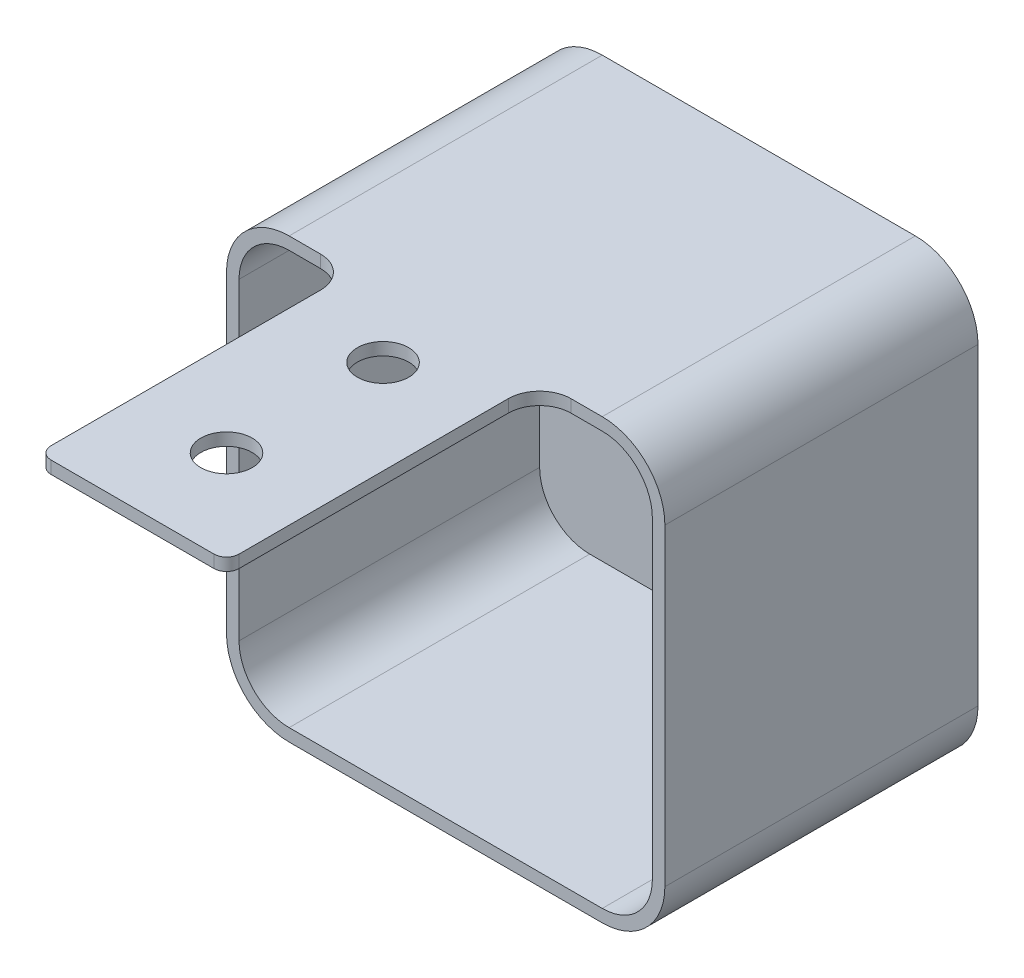
ISO-10303-21;
HEADER;
FILE_DESCRIPTION(('STEP AP214'),'2;1');
FILE_NAME('part.step','',(''),(''),'','','');
FILE_SCHEMA(('AUTOMOTIVE_DESIGN { 1 0 10303 214 1 1 1 1 }'));
ENDSEC;
DATA;
#1=APPLICATION_CONTEXT('core data for automotive mechanical design processes');
#2=APPLICATION_PROTOCOL_DEFINITION('international standard','automotive_design',2000,#1);
#3=PRODUCT_CONTEXT('',#1,'mechanical');
#4=PRODUCT('Part','Part','',(#3));
#5=PRODUCT_RELATED_PRODUCT_CATEGORY('part','',(#4));
#6=PRODUCT_DEFINITION_FORMATION('','',#4);
#7=PRODUCT_DEFINITION_CONTEXT('part definition',#1,'design');
#8=PRODUCT_DEFINITION('design','',#6,#7);
#9=PRODUCT_DEFINITION_SHAPE('','',#8);
#10=(LENGTH_UNIT() NAMED_UNIT(*) SI_UNIT(.MILLI.,.METRE.));
#11=(NAMED_UNIT(*) PLANE_ANGLE_UNIT() SI_UNIT($,.RADIAN.));
#12=(NAMED_UNIT(*) SI_UNIT($,.STERADIAN.) SOLID_ANGLE_UNIT());
#13=UNCERTAINTY_MEASURE_WITH_UNIT(LENGTH_MEASURE(1.E-05),#10,'distance_accuracy_value','');
#14=(GEOMETRIC_REPRESENTATION_CONTEXT(3) GLOBAL_UNCERTAINTY_ASSIGNED_CONTEXT((#13)) GLOBAL_UNIT_ASSIGNED_CONTEXT((#10,
#11,#12)) REPRESENTATION_CONTEXT('',''));
#15=CARTESIAN_POINT('',(0.,0.,0.));
#16=DIRECTION('',(0.,0.,1.));
#17=DIRECTION('',(1.,0.,0.));
#18=AXIS2_PLACEMENT_3D('',#15,#16,#17);
#19=CARTESIAN_POINT('',(0.,0.,50.));
#20=DIRECTION('',(0.,0.,-1.));
#21=DIRECTION('',(-1.,0.,0.));
#22=AXIS2_PLACEMENT_3D('',#19,#20,#21);
#23=PLANE('',#22);
#24=DIRECTION('',(-1.,0.,0.));
#25=VECTOR('',#24,1.);
#26=CARTESIAN_POINT('',(-35.,35.,50.));
#27=LINE('',#26,#25);
#28=CARTESIAN_POINT('',(25.,35.,50.));
#29=VERTEX_POINT('',#28);
#30=CARTESIAN_POINT('',(20.,35.,50.));
#31=VERTEX_POINT('',#30);
#32=EDGE_CURVE('E262',#29,#31,#27,.T.);
#33=ORIENTED_EDGE('',*,*,#32,.T.);
#34=DIRECTION('',(0.,1.,0.));
#35=VECTOR('',#34,1.);
#36=CARTESIAN_POINT('',(20.,0.,50.));
#37=LINE('',#36,#35);
#38=CARTESIAN_POINT('',(20.,33.,50.));
#39=VERTEX_POINT('',#38);
#40=EDGE_CURVE('E281',#31,#39,#37,.F.);
#41=ORIENTED_EDGE('',*,*,#40,.T.);
#42=DIRECTION('',(-1.,0.,0.));
#43=VECTOR('',#42,1.);
#44=CARTESIAN_POINT('',(0.,33.,50.));
#45=LINE('',#44,#43);
#46=CARTESIAN_POINT('',(25.,33.,50.));
#47=VERTEX_POINT('',#46);
#48=EDGE_CURVE('E257',#47,#39,#45,.T.);
#49=ORIENTED_EDGE('',*,*,#48,.F.);
#50=CARTESIAN_POINT('',(25.,25.,50.));
#51=DIRECTION('',(0.,0.,-1.));
#52=DIRECTION('',(-1.,0.,0.));
#53=AXIS2_PLACEMENT_3D('',#50,#51,#52);
#54=CIRCLE('',#53,8.);
#55=CARTESIAN_POINT('',(33.,25.,50.));
#56=VERTEX_POINT('',#55);
#57=EDGE_CURVE('E246',#56,#47,#54,.F.);
#58=ORIENTED_EDGE('',*,*,#57,.F.);
#59=DIRECTION('',(0.,1.,0.));
#60=VECTOR('',#59,1.);
#61=CARTESIAN_POINT('',(33.,0.,50.));
#62=LINE('',#61,#60);
#63=CARTESIAN_POINT('',(33.,-25.,50.));
#64=VERTEX_POINT('',#63);
#65=EDGE_CURVE('E243',#64,#56,#62,.T.);
#66=ORIENTED_EDGE('',*,*,#65,.F.);
#67=CARTESIAN_POINT('',(25.,-25.,50.));
#68=DIRECTION('',(0.,0.,-1.));
#69=DIRECTION('',(-1.,0.,0.));
#70=AXIS2_PLACEMENT_3D('',#67,#68,#69);
#71=CIRCLE('',#70,8.);
#72=CARTESIAN_POINT('',(25.,-33.,50.));
#73=VERTEX_POINT('',#72);
#74=EDGE_CURVE('E225',#73,#64,#71,.F.);
#75=ORIENTED_EDGE('',*,*,#74,.F.);
#76=DIRECTION('',(1.,0.,0.));
#77=VECTOR('',#76,1.);
#78=CARTESIAN_POINT('',(0.,-33.,50.));
#79=LINE('',#78,#77);
#80=CARTESIAN_POINT('',(-25.,-33.,50.));
#81=VERTEX_POINT('',#80);
#82=EDGE_CURVE('E235',#81,#73,#79,.T.);
#83=ORIENTED_EDGE('',*,*,#82,.F.);
#84=CARTESIAN_POINT('',(-25.,-25.,50.));
#85=DIRECTION('',(0.,0.,-1.));
#86=DIRECTION('',(-1.,0.,0.));
#87=AXIS2_PLACEMENT_3D('',#84,#85,#86);
#88=CIRCLE('',#87,8.);
#89=CARTESIAN_POINT('',(-33.,-25.,50.));
#90=VERTEX_POINT('',#89);
#91=EDGE_CURVE('E223',#90,#81,#88,.F.);
#92=ORIENTED_EDGE('',*,*,#91,.F.);
#93=DIRECTION('',(0.,-1.,0.));
#94=VECTOR('',#93,1.);
#95=CARTESIAN_POINT('',(-33.,0.,50.));
#96=LINE('',#95,#94);
#97=CARTESIAN_POINT('',(-33.,25.,50.));
#98=VERTEX_POINT('',#97);
#99=EDGE_CURVE('E261',#98,#90,#96,.T.);
#100=ORIENTED_EDGE('',*,*,#99,.F.);
#101=CARTESIAN_POINT('',(-25.,25.,50.));
#102=DIRECTION('',(0.,0.,-1.));
#103=DIRECTION('',(-1.,0.,0.));
#104=AXIS2_PLACEMENT_3D('',#101,#102,#103);
#105=CIRCLE('',#104,8.);
#106=CARTESIAN_POINT('',(-25.,33.,50.));
#107=VERTEX_POINT('',#106);
#108=EDGE_CURVE('E248',#107,#98,#105,.F.);
#109=ORIENTED_EDGE('',*,*,#108,.F.);
#110=CARTESIAN_POINT('',(-20.,33.,50.));
#111=VERTEX_POINT('',#110);
#112=EDGE_CURVE('E222',#111,#107,#45,.T.);
#113=ORIENTED_EDGE('',*,*,#112,.F.);
#114=DIRECTION('',(0.,1.,0.));
#115=VECTOR('',#114,1.);
#116=CARTESIAN_POINT('',(-20.,0.,50.));
#117=LINE('',#116,#115);
#118=CARTESIAN_POINT('',(-20.,35.,50.));
#119=VERTEX_POINT('',#118);
#120=EDGE_CURVE('E303',#111,#119,#117,.T.);
#121=ORIENTED_EDGE('',*,*,#120,.T.);
#122=CARTESIAN_POINT('',(-25.,35.,50.));
#123=VERTEX_POINT('',#122);
#124=EDGE_CURVE('E368',#119,#123,#27,.T.);
#125=ORIENTED_EDGE('',*,*,#124,.T.);
#126=CARTESIAN_POINT('',(-25.,25.,50.));
#127=DIRECTION('',(0.,0.,-1.));
#128=DIRECTION('',(-1.,0.,0.));
#129=AXIS2_PLACEMENT_3D('',#126,#127,#128);
#130=CIRCLE('',#129,10.);
#131=CARTESIAN_POINT('',(-35.,25.,50.));
#132=VERTEX_POINT('',#131);
#133=EDGE_CURVE('E322',#123,#132,#130,.F.);
#134=ORIENTED_EDGE('',*,*,#133,.T.);
#135=DIRECTION('',(0.,-1.,0.));
#136=VECTOR('',#135,1.);
#137=CARTESIAN_POINT('',(-35.,-35.,50.));
#138=LINE('',#137,#136);
#139=CARTESIAN_POINT('',(-35.,-25.,50.));
#140=VERTEX_POINT('',#139);
#141=EDGE_CURVE('E362',#132,#140,#138,.T.);
#142=ORIENTED_EDGE('',*,*,#141,.T.);
#143=CARTESIAN_POINT('',(-25.,-25.,50.));
#144=DIRECTION('',(0.,0.,-1.));
#145=DIRECTION('',(-1.,0.,0.));
#146=AXIS2_PLACEMENT_3D('',#143,#144,#145);
#147=CIRCLE('',#146,10.);
#148=CARTESIAN_POINT('',(-25.,-35.,50.));
#149=VERTEX_POINT('',#148);
#150=EDGE_CURVE('E328',#140,#149,#147,.F.);
#151=ORIENTED_EDGE('',*,*,#150,.T.);
#152=DIRECTION('',(1.,0.,0.));
#153=VECTOR('',#152,1.);
#154=CARTESIAN_POINT('',(-35.,-35.,50.));
#155=LINE('',#154,#153);
#156=CARTESIAN_POINT('',(25.,-35.,50.));
#157=VERTEX_POINT('',#156);
#158=EDGE_CURVE('E349',#149,#157,#155,.T.);
#159=ORIENTED_EDGE('',*,*,#158,.T.);
#160=CARTESIAN_POINT('',(25.,-25.,50.));
#161=DIRECTION('',(0.,0.,-1.));
#162=DIRECTION('',(-1.,0.,0.));
#163=AXIS2_PLACEMENT_3D('',#160,#161,#162);
#164=CIRCLE('',#163,10.);
#165=CARTESIAN_POINT('',(35.,-25.,50.));
#166=VERTEX_POINT('',#165);
#167=EDGE_CURVE('E326',#157,#166,#164,.F.);
#168=ORIENTED_EDGE('',*,*,#167,.T.);
#169=DIRECTION('',(0.,1.,0.));
#170=VECTOR('',#169,1.);
#171=CARTESIAN_POINT('',(35.,-35.,50.));
#172=LINE('',#171,#170);
#173=CARTESIAN_POINT('',(35.,25.,50.));
#174=VERTEX_POINT('',#173);
#175=EDGE_CURVE('E352',#166,#174,#172,.T.);
#176=ORIENTED_EDGE('',*,*,#175,.T.);
#177=CARTESIAN_POINT('',(25.,25.,50.));
#178=DIRECTION('',(0.,0.,-1.));
#179=DIRECTION('',(-1.,0.,0.));
#180=AXIS2_PLACEMENT_3D('',#177,#178,#179);
#181=CIRCLE('',#180,10.);
#182=EDGE_CURVE('E324',#174,#29,#181,.F.);
#183=ORIENTED_EDGE('',*,*,#182,.T.);
#184=EDGE_LOOP('',(#33,#41,#49,#58,#66,#75,#83,#92,#100,#109,#113,#121,#125,#134,#142,#151,#159,
#168,#176,#183));
#185=FACE_BOUND('',#184,.T.);
#186=ADVANCED_FACE('F35',(#185),#23,.F.);
#187=CARTESIAN_POINT('',(35.,-35.,50.));
#188=DIRECTION('',(-1.,0.,0.));
#189=DIRECTION('',(0.,0.,1.));
#190=AXIS2_PLACEMENT_3D('',#187,#188,#189);
#191=PLANE('',#190);
#192=DIRECTION('',(0.,1.,0.));
#193=VECTOR('',#192,1.);
#194=CARTESIAN_POINT('',(35.,-35.,0.));
#195=LINE('',#194,#193);
#196=CARTESIAN_POINT('',(35.,-25.,0.));
#197=VERTEX_POINT('',#196);
#198=CARTESIAN_POINT('',(35.,25.,0.));
#199=VERTEX_POINT('',#198);
#200=EDGE_CURVE('E242',#197,#199,#195,.T.);
#201=ORIENTED_EDGE('',*,*,#200,.T.);
#202=DIRECTION('',(0.,0.,-1.));
#203=VECTOR('',#202,1.);
#204=CARTESIAN_POINT('',(35.,25.,50.));
#205=LINE('',#204,#203);
#206=EDGE_CURVE('E315',#199,#174,#205,.F.);
#207=ORIENTED_EDGE('',*,*,#206,.T.);
#208=ORIENTED_EDGE('',*,*,#175,.F.);
#209=DIRECTION('',(0.,0.,-1.));
#210=VECTOR('',#209,1.);
#211=CARTESIAN_POINT('',(35.,-25.,50.));
#212=LINE('',#211,#210);
#213=EDGE_CURVE('E319',#166,#197,#212,.T.);
#214=ORIENTED_EDGE('',*,*,#213,.T.);
#215=EDGE_LOOP('',(#201,#207,#208,#214));
#216=FACE_BOUND('',#215,.T.);
#217=ADVANCED_FACE('F467',(#216),#191,.F.);
#218=CARTESIAN_POINT('',(-35.,35.,50.));
#219=DIRECTION('',(0.,-1.,0.));
#220=DIRECTION('',(0.,0.,-1.));
#221=AXIS2_PLACEMENT_3D('',#218,#219,#220);
#222=PLANE('',#221);
#223=DIRECTION('',(0.,0.,1.));
#224=VECTOR('',#223,1.);
#225=CARTESIAN_POINT('',(-15.,35.,50.));
#226=LINE('',#225,#224);
#227=CARTESIAN_POINT('',(-15.,35.,55.));
#228=VERTEX_POINT('',#227);
#229=CARTESIAN_POINT('',(-15.,35.,98.));
#230=VERTEX_POINT('',#229);
#231=EDGE_CURVE('E270',#228,#230,#226,.T.);
#232=ORIENTED_EDGE('',*,*,#231,.T.);
#233=CARTESIAN_POINT('',(-13.,35.,98.));
#234=DIRECTION('',(0.,-1.,0.));
#235=DIRECTION('',(0.,0.,-1.));
#236=AXIS2_PLACEMENT_3D('',#233,#234,#235);
#237=CIRCLE('',#236,2.);
#238=CARTESIAN_POINT('',(-13.,35.,100.));
#239=VERTEX_POINT('',#238);
#240=EDGE_CURVE('E396',#230,#239,#237,.F.);
#241=ORIENTED_EDGE('',*,*,#240,.T.);
#242=DIRECTION('',(1.,0.,0.));
#243=VECTOR('',#242,1.);
#244=CARTESIAN_POINT('',(-15.,35.,100.));
#245=LINE('',#244,#243);
#246=CARTESIAN_POINT('',(13.,35.,100.));
#247=VERTEX_POINT('',#246);
#248=EDGE_CURVE('E274',#239,#247,#245,.T.);
#249=ORIENTED_EDGE('',*,*,#248,.T.);
#250=CARTESIAN_POINT('',(13.,35.,98.));
#251=DIRECTION('',(0.,-1.,0.));
#252=DIRECTION('',(0.,0.,-1.));
#253=AXIS2_PLACEMENT_3D('',#250,#251,#252);
#254=CIRCLE('',#253,2.);
#255=CARTESIAN_POINT('',(15.,35.,98.));
#256=VERTEX_POINT('',#255);
#257=EDGE_CURVE('E293',#247,#256,#254,.F.);
#258=ORIENTED_EDGE('',*,*,#257,.T.);
#259=DIRECTION('',(0.,0.,-1.));
#260=VECTOR('',#259,1.);
#261=CARTESIAN_POINT('',(15.,35.,50.));
#262=LINE('',#261,#260);
#263=CARTESIAN_POINT('',(15.,35.,55.));
#264=VERTEX_POINT('',#263);
#265=EDGE_CURVE('E294',#256,#264,#262,.T.);
#266=ORIENTED_EDGE('',*,*,#265,.T.);
#267=CARTESIAN_POINT('',(20.,35.,55.));
#268=DIRECTION('',(0.,-1.,0.));
#269=DIRECTION('',(0.,0.,-1.));
#270=AXIS2_PLACEMENT_3D('',#267,#268,#269);
#271=CIRCLE('',#270,5.);
#272=EDGE_CURVE('E280',#264,#31,#271,.T.);
#273=ORIENTED_EDGE('',*,*,#272,.T.);
#274=ORIENTED_EDGE('',*,*,#32,.F.);
#275=DIRECTION('',(0.,0.,-1.));
#276=VECTOR('',#275,1.);
#277=CARTESIAN_POINT('',(25.,35.,50.));
#278=LINE('',#277,#276);
#279=CARTESIAN_POINT('',(25.,35.,0.));
#280=VERTEX_POINT('',#279);
#281=EDGE_CURVE('E333',#29,#280,#278,.T.);
#282=ORIENTED_EDGE('',*,*,#281,.T.);
#283=DIRECTION('',(-1.,0.,0.));
#284=VECTOR('',#283,1.);
#285=CARTESIAN_POINT('',(-35.,35.,0.));
#286=LINE('',#285,#284);
#287=CARTESIAN_POINT('',(-25.,35.,0.));
#288=VERTEX_POINT('',#287);
#289=EDGE_CURVE('E356',#280,#288,#286,.T.);
#290=ORIENTED_EDGE('',*,*,#289,.T.);
#291=DIRECTION('',(0.,0.,-1.));
#292=VECTOR('',#291,1.);
#293=CARTESIAN_POINT('',(-25.,35.,50.));
#294=LINE('',#293,#292);
#295=EDGE_CURVE('E330',#288,#123,#294,.F.);
#296=ORIENTED_EDGE('',*,*,#295,.T.);
#297=ORIENTED_EDGE('',*,*,#124,.F.);
#298=CARTESIAN_POINT('',(-20.,35.,55.));
#299=DIRECTION('',(0.,-1.,0.));
#300=DIRECTION('',(0.,0.,-1.));
#301=AXIS2_PLACEMENT_3D('',#298,#299,#300);
#302=CIRCLE('',#301,5.);
#303=EDGE_CURVE('E286',#119,#228,#302,.T.);
#304=ORIENTED_EDGE('',*,*,#303,.T.);
#305=EDGE_LOOP('',(#232,#241,#249,#258,#266,#273,#274,#282,#290,#296,#297,#304));
#306=FACE_BOUND('',#305,.T.);
#307=CARTESIAN_POINT('',(0.,35.,59.9999999999999));
#308=DIRECTION('',(0.,1.,0.));
#309=DIRECTION('',(0.,0.,1.));
#310=AXIS2_PLACEMENT_3D('',#307,#308,#309);
#311=CIRCLE('',#310,4.1);
#312=CARTESIAN_POINT('',(0.,35.,64.0999999999999));
#313=VERTEX_POINT('',#312);
#314=EDGE_CURVE('E275',#313,#313,#311,.T.);
#315=ORIENTED_EDGE('',*,*,#314,.F.);
#316=EDGE_LOOP('',(#315));
#317=FACE_BOUND('',#316,.T.);
#318=CARTESIAN_POINT('',(0.,35.,84.9999999999999));
#319=DIRECTION('',(0.,1.,0.));
#320=DIRECTION('',(0.,0.,1.));
#321=AXIS2_PLACEMENT_3D('',#318,#319,#320);
#322=CIRCLE('',#321,4.1);
#323=CARTESIAN_POINT('',(0.,35.,89.0999999999999));
#324=VERTEX_POINT('',#323);
#325=EDGE_CURVE('E454',#324,#324,#322,.T.);
#326=ORIENTED_EDGE('',*,*,#325,.F.);
#327=EDGE_LOOP('',(#326));
#328=FACE_BOUND('',#327,.T.);
#329=ADVANCED_FACE('F380',(#306,#317,#328),#222,.F.);
#330=CARTESIAN_POINT('',(-35.,-35.,50.));
#331=DIRECTION('',(1.,0.,0.));
#332=DIRECTION('',(0.,0.,-1.));
#333=AXIS2_PLACEMENT_3D('',#330,#331,#332);
#334=PLANE('',#333);
#335=ORIENTED_EDGE('',*,*,#141,.F.);
#336=DIRECTION('',(0.,0.,-1.));
#337=VECTOR('',#336,1.);
#338=CARTESIAN_POINT('',(-35.,25.,50.));
#339=LINE('',#338,#337);
#340=CARTESIAN_POINT('',(-35.,25.,0.));
#341=VERTEX_POINT('',#340);
#342=EDGE_CURVE('E344',#132,#341,#339,.T.);
#343=ORIENTED_EDGE('',*,*,#342,.T.);
#344=DIRECTION('',(0.,-1.,0.));
#345=VECTOR('',#344,1.);
#346=CARTESIAN_POINT('',(-35.,-35.,0.));
#347=LINE('',#346,#345);
#348=CARTESIAN_POINT('',(-35.,-25.,0.));
#349=VERTEX_POINT('',#348);
#350=EDGE_CURVE('E353',#341,#349,#347,.T.);
#351=ORIENTED_EDGE('',*,*,#350,.T.);
#352=DIRECTION('',(0.,0.,-1.));
#353=VECTOR('',#352,1.);
#354=CARTESIAN_POINT('',(-35.,-25.,50.));
#355=LINE('',#354,#353);
#356=EDGE_CURVE('E347',#349,#140,#355,.F.);
#357=ORIENTED_EDGE('',*,*,#356,.T.);
#358=EDGE_LOOP('',(#335,#343,#351,#357));
#359=FACE_BOUND('',#358,.T.);
#360=ADVANCED_FACE('F466',(#359),#334,.F.);
#361=CARTESIAN_POINT('',(-35.,-35.,50.));
#362=DIRECTION('',(0.,1.,0.));
#363=DIRECTION('',(0.,0.,1.));
#364=AXIS2_PLACEMENT_3D('',#361,#362,#363);
#365=PLANE('',#364);
#366=DIRECTION('',(1.,0.,0.));
#367=VECTOR('',#366,1.);
#368=CARTESIAN_POINT('',(-35.,-35.,0.));
#369=LINE('',#368,#367);
#370=CARTESIAN_POINT('',(-25.,-35.,0.));
#371=VERTEX_POINT('',#370);
#372=CARTESIAN_POINT('',(25.,-35.,0.));
#373=VERTEX_POINT('',#372);
#374=EDGE_CURVE('E350',#371,#373,#369,.T.);
#375=ORIENTED_EDGE('',*,*,#374,.T.);
#376=DIRECTION('',(0.,0.,-1.));
#377=VECTOR('',#376,1.);
#378=CARTESIAN_POINT('',(25.,-35.,50.));
#379=LINE('',#378,#377);
#380=EDGE_CURVE('E304',#373,#157,#379,.F.);
#381=ORIENTED_EDGE('',*,*,#380,.T.);
#382=ORIENTED_EDGE('',*,*,#158,.F.);
#383=DIRECTION('',(0.,0.,-1.));
#384=VECTOR('',#383,1.);
#385=CARTESIAN_POINT('',(-25.,-35.,50.));
#386=LINE('',#385,#384);
#387=EDGE_CURVE('E308',#149,#371,#386,.T.);
#388=ORIENTED_EDGE('',*,*,#387,.T.);
#389=EDGE_LOOP('',(#375,#381,#382,#388));
#390=FACE_BOUND('',#389,.T.);
#391=ADVANCED_FACE('F473',(#390),#365,.F.);
#392=CARTESIAN_POINT('',(0.,0.,0.));
#393=DIRECTION('',(0.,0.,-1.));
#394=DIRECTION('',(-1.,0.,0.));
#395=AXIS2_PLACEMENT_3D('',#392,#393,#394);
#396=PLANE('',#395);
#397=ORIENTED_EDGE('',*,*,#350,.F.);
#398=CARTESIAN_POINT('',(-25.,25.,0.));
#399=DIRECTION('',(0.,0.,-1.));
#400=DIRECTION('',(-1.,0.,0.));
#401=AXIS2_PLACEMENT_3D('',#398,#399,#400);
#402=CIRCLE('',#401,10.);
#403=EDGE_CURVE('E336',#341,#288,#402,.T.);
#404=ORIENTED_EDGE('',*,*,#403,.T.);
#405=ORIENTED_EDGE('',*,*,#289,.F.);
#406=CARTESIAN_POINT('',(25.,25.,0.));
#407=DIRECTION('',(0.,0.,-1.));
#408=DIRECTION('',(-1.,0.,0.));
#409=AXIS2_PLACEMENT_3D('',#406,#407,#408);
#410=CIRCLE('',#409,10.);
#411=EDGE_CURVE('E338',#280,#199,#410,.T.);
#412=ORIENTED_EDGE('',*,*,#411,.T.);
#413=ORIENTED_EDGE('',*,*,#200,.F.);
#414=CARTESIAN_POINT('',(25.,-25.,0.));
#415=DIRECTION('',(0.,0.,-1.));
#416=DIRECTION('',(-1.,0.,0.));
#417=AXIS2_PLACEMENT_3D('',#414,#415,#416);
#418=CIRCLE('',#417,10.);
#419=EDGE_CURVE('E340',#197,#373,#418,.T.);
#420=ORIENTED_EDGE('',*,*,#419,.T.);
#421=ORIENTED_EDGE('',*,*,#374,.F.);
#422=CARTESIAN_POINT('',(-25.,-25.,0.));
#423=DIRECTION('',(0.,0.,-1.));
#424=DIRECTION('',(-1.,0.,0.));
#425=AXIS2_PLACEMENT_3D('',#422,#423,#424);
#426=CIRCLE('',#425,10.);
#427=EDGE_CURVE('E342',#371,#349,#426,.T.);
#428=ORIENTED_EDGE('',*,*,#427,.T.);
#429=EDGE_LOOP('',(#397,#404,#405,#412,#413,#420,#421,#428));
#430=FACE_BOUND('',#429,.T.);
#431=ADVANCED_FACE('F486',(#430),#396,.T.);
#432=CARTESIAN_POINT('',(-25.,25.,50.));
#433=DIRECTION('',(0.,0.,-1.));
#434=DIRECTION('',(-1.,0.,0.));
#435=AXIS2_PLACEMENT_3D('',#432,#433,#434);
#436=CYLINDRICAL_SURFACE('',#435,10.);
#437=ORIENTED_EDGE('',*,*,#133,.F.);
#438=ORIENTED_EDGE('',*,*,#295,.F.);
#439=ORIENTED_EDGE('',*,*,#403,.F.);
#440=ORIENTED_EDGE('',*,*,#342,.F.);
#441=EDGE_LOOP('',(#437,#438,#439,#440));
#442=FACE_BOUND('',#441,.T.);
#443=ADVANCED_FACE('F489',(#442),#436,.T.);
#444=CARTESIAN_POINT('',(25.,25.,50.));
#445=DIRECTION('',(0.,0.,-1.));
#446=DIRECTION('',(-1.,0.,0.));
#447=AXIS2_PLACEMENT_3D('',#444,#445,#446);
#448=CYLINDRICAL_SURFACE('',#447,10.);
#449=ORIENTED_EDGE('',*,*,#182,.F.);
#450=ORIENTED_EDGE('',*,*,#206,.F.);
#451=ORIENTED_EDGE('',*,*,#411,.F.);
#452=ORIENTED_EDGE('',*,*,#281,.F.);
#453=EDGE_LOOP('',(#449,#450,#451,#452));
#454=FACE_BOUND('',#453,.T.);
#455=ADVANCED_FACE('F506',(#454),#448,.T.);
#456=CARTESIAN_POINT('',(25.,-25.,50.));
#457=DIRECTION('',(0.,0.,-1.));
#458=DIRECTION('',(-1.,0.,0.));
#459=AXIS2_PLACEMENT_3D('',#456,#457,#458);
#460=CYLINDRICAL_SURFACE('',#459,10.);
#461=ORIENTED_EDGE('',*,*,#167,.F.);
#462=ORIENTED_EDGE('',*,*,#380,.F.);
#463=ORIENTED_EDGE('',*,*,#419,.F.);
#464=ORIENTED_EDGE('',*,*,#213,.F.);
#465=EDGE_LOOP('',(#461,#462,#463,#464));
#466=FACE_BOUND('',#465,.T.);
#467=ADVANCED_FACE('F498',(#466),#460,.T.);
#468=CARTESIAN_POINT('',(-25.,-25.,50.));
#469=DIRECTION('',(0.,0.,-1.));
#470=DIRECTION('',(-1.,0.,0.));
#471=AXIS2_PLACEMENT_3D('',#468,#469,#470);
#472=CYLINDRICAL_SURFACE('',#471,10.);
#473=ORIENTED_EDGE('',*,*,#150,.F.);
#474=ORIENTED_EDGE('',*,*,#356,.F.);
#475=ORIENTED_EDGE('',*,*,#427,.F.);
#476=ORIENTED_EDGE('',*,*,#387,.F.);
#477=EDGE_LOOP('',(#473,#474,#475,#476));
#478=FACE_BOUND('',#477,.T.);
#479=ADVANCED_FACE('F517',(#478),#472,.T.);
#480=CARTESIAN_POINT('',(33.,-35.,50.));
#481=DIRECTION('',(-1.,0.,0.));
#482=DIRECTION('',(0.,0.,1.));
#483=AXIS2_PLACEMENT_3D('',#480,#481,#482);
#484=PLANE('',#483);
#485=DIRECTION('',(0.,1.,0.));
#486=VECTOR('',#485,1.);
#487=CARTESIAN_POINT('',(33.,0.,2.));
#488=LINE('',#487,#486);
#489=CARTESIAN_POINT('',(33.,-25.,2.));
#490=VERTEX_POINT('',#489);
#491=CARTESIAN_POINT('',(33.,25.,2.));
#492=VERTEX_POINT('',#491);
#493=EDGE_CURVE('E217',#490,#492,#488,.T.);
#494=ORIENTED_EDGE('',*,*,#493,.F.);
#495=DIRECTION('',(0.,0.,1.));
#496=VECTOR('',#495,1.);
#497=CARTESIAN_POINT('',(33.,-25.,50.));
#498=LINE('',#497,#496);
#499=EDGE_CURVE('E420',#64,#490,#498,.F.);
#500=ORIENTED_EDGE('',*,*,#499,.F.);
#501=ORIENTED_EDGE('',*,*,#65,.T.);
#502=DIRECTION('',(0.,0.,1.));
#503=VECTOR('',#502,1.);
#504=CARTESIAN_POINT('',(33.,25.,50.));
#505=LINE('',#504,#503);
#506=EDGE_CURVE('E240',#492,#56,#505,.T.);
#507=ORIENTED_EDGE('',*,*,#506,.F.);
#508=EDGE_LOOP('',(#494,#500,#501,#507));
#509=FACE_BOUND('',#508,.T.);
#510=ADVANCED_FACE('F445',(#509),#484,.T.);
#511=CARTESIAN_POINT('',(-35.,33.,50.));
#512=DIRECTION('',(0.,-1.,0.));
#513=DIRECTION('',(0.,0.,-1.));
#514=AXIS2_PLACEMENT_3D('',#511,#512,#513);
#515=PLANE('',#514);
#516=DIRECTION('',(1.,0.,0.));
#517=VECTOR('',#516,1.);
#518=CARTESIAN_POINT('',(-15.,33.,100.));
#519=LINE('',#518,#517);
#520=CARTESIAN_POINT('',(-13.,33.,100.));
#521=VERTEX_POINT('',#520);
#522=CARTESIAN_POINT('',(13.,33.,100.));
#523=VERTEX_POINT('',#522);
#524=EDGE_CURVE('E394',#521,#523,#519,.T.);
#525=ORIENTED_EDGE('',*,*,#524,.F.);
#526=CARTESIAN_POINT('',(-13.,33.,98.));
#527=DIRECTION('',(0.,-1.,0.));
#528=DIRECTION('',(0.,0.,-1.));
#529=AXIS2_PLACEMENT_3D('',#526,#527,#528);
#530=CIRCLE('',#529,2.);
#531=CARTESIAN_POINT('',(-15.,33.,98.));
#532=VERTEX_POINT('',#531);
#533=EDGE_CURVE('E43',#521,#532,#530,.T.);
#534=ORIENTED_EDGE('',*,*,#533,.T.);
#535=DIRECTION('',(0.,0.,1.));
#536=VECTOR('',#535,1.);
#537=CARTESIAN_POINT('',(-15.,33.,50.));
#538=LINE('',#537,#536);
#539=CARTESIAN_POINT('',(-15.,33.,55.));
#540=VERTEX_POINT('',#539);
#541=EDGE_CURVE('E276',#540,#532,#538,.T.);
#542=ORIENTED_EDGE('',*,*,#541,.F.);
#543=CARTESIAN_POINT('',(-20.,33.,55.));
#544=DIRECTION('',(0.,-1.,0.));
#545=DIRECTION('',(0.,0.,-1.));
#546=AXIS2_PLACEMENT_3D('',#543,#544,#545);
#547=CIRCLE('',#546,5.);
#548=EDGE_CURVE('E288',#540,#111,#547,.F.);
#549=ORIENTED_EDGE('',*,*,#548,.T.);
#550=ORIENTED_EDGE('',*,*,#112,.T.);
#551=DIRECTION('',(0.,0.,-1.));
#552=VECTOR('',#551,1.);
#553=CARTESIAN_POINT('',(-25.,33.,50.));
#554=LINE('',#553,#552);
#555=CARTESIAN_POINT('',(-25.,33.,2.));
#556=VERTEX_POINT('',#555);
#557=EDGE_CURVE('E200',#556,#107,#554,.F.);
#558=ORIENTED_EDGE('',*,*,#557,.F.);
#559=DIRECTION('',(-1.,0.,0.));
#560=VECTOR('',#559,1.);
#561=CARTESIAN_POINT('',(0.,33.,2.));
#562=LINE('',#561,#560);
#563=CARTESIAN_POINT('',(25.,33.,2.));
#564=VERTEX_POINT('',#563);
#565=EDGE_CURVE('E211',#564,#556,#562,.T.);
#566=ORIENTED_EDGE('',*,*,#565,.F.);
#567=DIRECTION('',(0.,0.,-1.));
#568=VECTOR('',#567,1.);
#569=CARTESIAN_POINT('',(25.,33.,50.));
#570=LINE('',#569,#568);
#571=EDGE_CURVE('E207',#47,#564,#570,.T.);
#572=ORIENTED_EDGE('',*,*,#571,.F.);
#573=ORIENTED_EDGE('',*,*,#48,.T.);
#574=CARTESIAN_POINT('',(20.,33.,55.));
#575=DIRECTION('',(0.,-1.,0.));
#576=DIRECTION('',(0.,0.,-1.));
#577=AXIS2_PLACEMENT_3D('',#574,#575,#576);
#578=CIRCLE('',#577,5.);
#579=CARTESIAN_POINT('',(15.,33.,55.));
#580=VERTEX_POINT('',#579);
#581=EDGE_CURVE('E283',#39,#580,#578,.F.);
#582=ORIENTED_EDGE('',*,*,#581,.T.);
#583=DIRECTION('',(0.,0.,-1.));
#584=VECTOR('',#583,1.);
#585=CARTESIAN_POINT('',(15.,33.,50.));
#586=LINE('',#585,#584);
#587=CARTESIAN_POINT('',(15.,33.,98.));
#588=VERTEX_POINT('',#587);
#589=EDGE_CURVE('E393',#588,#580,#586,.T.);
#590=ORIENTED_EDGE('',*,*,#589,.F.);
#591=CARTESIAN_POINT('',(13.,33.,98.));
#592=DIRECTION('',(0.,-1.,0.));
#593=DIRECTION('',(0.,0.,-1.));
#594=AXIS2_PLACEMENT_3D('',#591,#592,#593);
#595=CIRCLE('',#594,2.);
#596=EDGE_CURVE('E55',#588,#523,#595,.T.);
#597=ORIENTED_EDGE('',*,*,#596,.T.);
#598=EDGE_LOOP('',(#525,#534,#542,#549,#550,#558,#566,#572,#573,#582,#590,#597));
#599=FACE_BOUND('',#598,.T.);
#600=CARTESIAN_POINT('',(0.,33.,59.9999999999999));
#601=DIRECTION('',(0.,-1.,0.));
#602=DIRECTION('',(0.,0.,-1.));
#603=AXIS2_PLACEMENT_3D('',#600,#601,#602);
#604=CIRCLE('',#603,4.1);
#605=CARTESIAN_POINT('',(0.,33.,55.8999999999999));
#606=VERTEX_POINT('',#605);
#607=EDGE_CURVE('E297',#606,#606,#604,.F.);
#608=ORIENTED_EDGE('',*,*,#607,.T.);
#609=EDGE_LOOP('',(#608));
#610=FACE_BOUND('',#609,.T.);
#611=CARTESIAN_POINT('',(0.,33.,84.9999999999999));
#612=DIRECTION('',(0.,-1.,0.));
#613=DIRECTION('',(0.,0.,-1.));
#614=AXIS2_PLACEMENT_3D('',#611,#612,#613);
#615=CIRCLE('',#614,4.1);
#616=CARTESIAN_POINT('',(0.,33.,80.8999999999999));
#617=VERTEX_POINT('',#616);
#618=EDGE_CURVE('E449',#617,#617,#615,.F.);
#619=ORIENTED_EDGE('',*,*,#618,.T.);
#620=EDGE_LOOP('',(#619));
#621=FACE_BOUND('',#620,.T.);
#622=ADVANCED_FACE('F219',(#599,#610,#621),#515,.T.);
#623=CARTESIAN_POINT('',(-33.,-35.,50.));
#624=DIRECTION('',(1.,0.,0.));
#625=DIRECTION('',(0.,0.,-1.));
#626=AXIS2_PLACEMENT_3D('',#623,#624,#625);
#627=PLANE('',#626);
#628=ORIENTED_EDGE('',*,*,#99,.T.);
#629=DIRECTION('',(0.,0.,-1.));
#630=VECTOR('',#629,1.);
#631=CARTESIAN_POINT('',(-33.,-25.,50.));
#632=LINE('',#631,#630);
#633=CARTESIAN_POINT('',(-33.,-25.,2.));
#634=VERTEX_POINT('',#633);
#635=EDGE_CURVE('E233',#634,#90,#632,.F.);
#636=ORIENTED_EDGE('',*,*,#635,.F.);
#637=DIRECTION('',(0.,-1.,0.));
#638=VECTOR('',#637,1.);
#639=CARTESIAN_POINT('',(-33.,0.,2.));
#640=LINE('',#639,#638);
#641=CARTESIAN_POINT('',(-33.,25.,2.));
#642=VERTEX_POINT('',#641);
#643=EDGE_CURVE('E216',#642,#634,#640,.T.);
#644=ORIENTED_EDGE('',*,*,#643,.F.);
#645=DIRECTION('',(0.,0.,-1.));
#646=VECTOR('',#645,1.);
#647=CARTESIAN_POINT('',(-33.,25.,50.));
#648=LINE('',#647,#646);
#649=EDGE_CURVE('E203',#98,#642,#648,.T.);
#650=ORIENTED_EDGE('',*,*,#649,.F.);
#651=EDGE_LOOP('',(#628,#636,#644,#650));
#652=FACE_BOUND('',#651,.T.);
#653=ADVANCED_FACE('F578',(#652),#627,.T.);
#654=CARTESIAN_POINT('',(-35.,-33.,50.));
#655=DIRECTION('',(0.,1.,0.));
#656=DIRECTION('',(0.,0.,1.));
#657=AXIS2_PLACEMENT_3D('',#654,#655,#656);
#658=PLANE('',#657);
#659=DIRECTION('',(1.,0.,0.));
#660=VECTOR('',#659,1.);
#661=CARTESIAN_POINT('',(0.,-33.,2.));
#662=LINE('',#661,#660);
#663=CARTESIAN_POINT('',(-25.,-33.,2.));
#664=VERTEX_POINT('',#663);
#665=CARTESIAN_POINT('',(25.,-33.,2.));
#666=VERTEX_POINT('',#665);
#667=EDGE_CURVE('E245',#664,#666,#662,.T.);
#668=ORIENTED_EDGE('',*,*,#667,.F.);
#669=DIRECTION('',(0.,0.,1.));
#670=VECTOR('',#669,1.);
#671=CARTESIAN_POINT('',(-25.,-33.,50.));
#672=LINE('',#671,#670);
#673=EDGE_CURVE('E236',#81,#664,#672,.F.);
#674=ORIENTED_EDGE('',*,*,#673,.F.);
#675=ORIENTED_EDGE('',*,*,#82,.T.);
#676=DIRECTION('',(0.,0.,1.));
#677=VECTOR('',#676,1.);
#678=CARTESIAN_POINT('',(25.,-33.,50.));
#679=LINE('',#678,#677);
#680=EDGE_CURVE('E239',#666,#73,#679,.T.);
#681=ORIENTED_EDGE('',*,*,#680,.F.);
#682=EDGE_LOOP('',(#668,#674,#675,#681));
#683=FACE_BOUND('',#682,.T.);
#684=ADVANCED_FACE('F439',(#683),#658,.T.);
#685=CARTESIAN_POINT('',(0.,0.,2.));
#686=DIRECTION('',(0.,0.,-1.));
#687=DIRECTION('',(-1.,0.,0.));
#688=AXIS2_PLACEMENT_3D('',#685,#686,#687);
#689=PLANE('',#688);
#690=ORIENTED_EDGE('',*,*,#643,.T.);
#691=CARTESIAN_POINT('',(-25.,-25.,2.));
#692=DIRECTION('',(0.,0.,-1.));
#693=DIRECTION('',(-1.,0.,0.));
#694=AXIS2_PLACEMENT_3D('',#691,#692,#693);
#695=CIRCLE('',#694,8.);
#696=EDGE_CURVE('E229',#664,#634,#695,.T.);
#697=ORIENTED_EDGE('',*,*,#696,.F.);
#698=ORIENTED_EDGE('',*,*,#667,.T.);
#699=CARTESIAN_POINT('',(25.,-25.,2.));
#700=DIRECTION('',(0.,0.,-1.));
#701=DIRECTION('',(-1.,0.,0.));
#702=AXIS2_PLACEMENT_3D('',#699,#700,#701);
#703=CIRCLE('',#702,8.);
#704=EDGE_CURVE('E432',#490,#666,#703,.T.);
#705=ORIENTED_EDGE('',*,*,#704,.F.);
#706=ORIENTED_EDGE('',*,*,#493,.T.);
#707=CARTESIAN_POINT('',(25.,25.,2.));
#708=DIRECTION('',(0.,0.,-1.));
#709=DIRECTION('',(-1.,0.,0.));
#710=AXIS2_PLACEMENT_3D('',#707,#708,#709);
#711=CIRCLE('',#710,8.);
#712=EDGE_CURVE('E208',#564,#492,#711,.T.);
#713=ORIENTED_EDGE('',*,*,#712,.F.);
#714=ORIENTED_EDGE('',*,*,#565,.T.);
#715=CARTESIAN_POINT('',(-25.,25.,2.));
#716=DIRECTION('',(0.,0.,-1.));
#717=DIRECTION('',(-1.,0.,0.));
#718=AXIS2_PLACEMENT_3D('',#715,#716,#717);
#719=CIRCLE('',#718,8.);
#720=EDGE_CURVE('E196',#642,#556,#719,.T.);
#721=ORIENTED_EDGE('',*,*,#720,.F.);
#722=EDGE_LOOP('',(#690,#697,#698,#705,#706,#713,#714,#721));
#723=FACE_BOUND('',#722,.T.);
#724=ADVANCED_FACE('F212',(#723),#689,.F.);
#725=CARTESIAN_POINT('',(-25.,25.,50.));
#726=DIRECTION('',(0.,0.,-1.));
#727=DIRECTION('',(-1.,0.,0.));
#728=AXIS2_PLACEMENT_3D('',#725,#726,#727);
#729=CYLINDRICAL_SURFACE('',#728,8.);
#730=ORIENTED_EDGE('',*,*,#108,.T.);
#731=ORIENTED_EDGE('',*,*,#649,.T.);
#732=ORIENTED_EDGE('',*,*,#720,.T.);
#733=ORIENTED_EDGE('',*,*,#557,.T.);
#734=EDGE_LOOP('',(#730,#731,#732,#733));
#735=FACE_BOUND('',#734,.T.);
#736=ADVANCED_FACE('F198',(#735),#729,.F.);
#737=CARTESIAN_POINT('',(25.,25.,50.));
#738=DIRECTION('',(0.,0.,-1.));
#739=DIRECTION('',(-1.,0.,0.));
#740=AXIS2_PLACEMENT_3D('',#737,#738,#739);
#741=CYLINDRICAL_SURFACE('',#740,8.);
#742=ORIENTED_EDGE('',*,*,#57,.T.);
#743=ORIENTED_EDGE('',*,*,#571,.T.);
#744=ORIENTED_EDGE('',*,*,#712,.T.);
#745=ORIENTED_EDGE('',*,*,#506,.T.);
#746=EDGE_LOOP('',(#742,#743,#744,#745));
#747=FACE_BOUND('',#746,.T.);
#748=ADVANCED_FACE('F448',(#747),#741,.F.);
#749=CARTESIAN_POINT('',(25.,-25.,50.));
#750=DIRECTION('',(0.,0.,-1.));
#751=DIRECTION('',(-1.,0.,0.));
#752=AXIS2_PLACEMENT_3D('',#749,#750,#751);
#753=CYLINDRICAL_SURFACE('',#752,8.);
#754=ORIENTED_EDGE('',*,*,#74,.T.);
#755=ORIENTED_EDGE('',*,*,#499,.T.);
#756=ORIENTED_EDGE('',*,*,#704,.T.);
#757=ORIENTED_EDGE('',*,*,#680,.T.);
#758=EDGE_LOOP('',(#754,#755,#756,#757));
#759=FACE_BOUND('',#758,.T.);
#760=ADVANCED_FACE('F442',(#759),#753,.F.);
#761=CARTESIAN_POINT('',(-25.,-25.,50.));
#762=DIRECTION('',(0.,0.,-1.));
#763=DIRECTION('',(-1.,0.,0.));
#764=AXIS2_PLACEMENT_3D('',#761,#762,#763);
#765=CYLINDRICAL_SURFACE('',#764,8.);
#766=ORIENTED_EDGE('',*,*,#91,.T.);
#767=ORIENTED_EDGE('',*,*,#673,.T.);
#768=ORIENTED_EDGE('',*,*,#696,.T.);
#769=ORIENTED_EDGE('',*,*,#635,.T.);
#770=EDGE_LOOP('',(#766,#767,#768,#769));
#771=FACE_BOUND('',#770,.T.);
#772=ADVANCED_FACE('F484',(#771),#765,.F.);
#773=CARTESIAN_POINT('',(-15.,-25.309518948453,50.));
#774=DIRECTION('',(-1.,0.,0.));
#775=DIRECTION('',(0.,0.,1.));
#776=AXIS2_PLACEMENT_3D('',#773,#774,#775);
#777=PLANE('',#776);
#778=ORIENTED_EDGE('',*,*,#541,.T.);
#779=DIRECTION('',(0.,1.,0.));
#780=VECTOR('',#779,1.);
#781=CARTESIAN_POINT('',(-15.,-25.309518948453,98.));
#782=LINE('',#781,#780);
#783=EDGE_CURVE('E290',#532,#230,#782,.T.);
#784=ORIENTED_EDGE('',*,*,#783,.T.);
#785=ORIENTED_EDGE('',*,*,#231,.F.);
#786=DIRECTION('',(0.,1.,0.));
#787=VECTOR('',#786,1.);
#788=CARTESIAN_POINT('',(-15.,-25.309518948453,55.));
#789=LINE('',#788,#787);
#790=EDGE_CURVE('E278',#228,#540,#789,.F.);
#791=ORIENTED_EDGE('',*,*,#790,.T.);
#792=EDGE_LOOP('',(#778,#784,#785,#791));
#793=FACE_BOUND('',#792,.T.);
#794=ADVANCED_FACE('F411',(#793),#777,.T.);
#795=CARTESIAN_POINT('',(15.,-25.309518948453,50.));
#796=DIRECTION('',(1.,0.,0.));
#797=DIRECTION('',(0.,0.,-1.));
#798=AXIS2_PLACEMENT_3D('',#795,#796,#797);
#799=PLANE('',#798);
#800=ORIENTED_EDGE('',*,*,#265,.F.);
#801=DIRECTION('',(0.,1.,0.));
#802=VECTOR('',#801,1.);
#803=CARTESIAN_POINT('',(15.,-25.309518948453,98.));
#804=LINE('',#803,#802);
#805=EDGE_CURVE('E11',#256,#588,#804,.F.);
#806=ORIENTED_EDGE('',*,*,#805,.T.);
#807=ORIENTED_EDGE('',*,*,#589,.T.);
#808=DIRECTION('',(0.,1.,0.));
#809=VECTOR('',#808,1.);
#810=CARTESIAN_POINT('',(15.,-25.309518948453,55.));
#811=LINE('',#810,#809);
#812=EDGE_CURVE('E301',#580,#264,#811,.T.);
#813=ORIENTED_EDGE('',*,*,#812,.T.);
#814=EDGE_LOOP('',(#800,#806,#807,#813));
#815=FACE_BOUND('',#814,.T.);
#816=ADVANCED_FACE('F384',(#815),#799,.T.);
#817=CARTESIAN_POINT('',(-15.,-25.309518948453,100.));
#818=DIRECTION('',(0.,0.,1.));
#819=DIRECTION('',(1.,0.,0.));
#820=AXIS2_PLACEMENT_3D('',#817,#818,#819);
#821=PLANE('',#820);
#822=ORIENTED_EDGE('',*,*,#248,.F.);
#823=DIRECTION('',(0.,1.,0.));
#824=VECTOR('',#823,1.);
#825=CARTESIAN_POINT('',(-13.,-25.309518948453,100.));
#826=LINE('',#825,#824);
#827=EDGE_CURVE('E389',#239,#521,#826,.F.);
#828=ORIENTED_EDGE('',*,*,#827,.T.);
#829=ORIENTED_EDGE('',*,*,#524,.T.);
#830=DIRECTION('',(0.,1.,0.));
#831=VECTOR('',#830,1.);
#832=CARTESIAN_POINT('',(13.,-25.309518948453,100.));
#833=LINE('',#832,#831);
#834=EDGE_CURVE('E388',#523,#247,#833,.T.);
#835=ORIENTED_EDGE('',*,*,#834,.T.);
#836=EDGE_LOOP('',(#822,#828,#829,#835));
#837=FACE_BOUND('',#836,.T.);
#838=ADVANCED_FACE('F403',(#837),#821,.T.);
#839=CARTESIAN_POINT('',(0.,-25.309518948453,84.9999999999999));
#840=DIRECTION('',(0.,1.,0.));
#841=DIRECTION('',(0.,0.,1.));
#842=AXIS2_PLACEMENT_3D('',#839,#840,#841);
#843=CYLINDRICAL_SURFACE('',#842,4.1);
#844=ORIENTED_EDGE('',*,*,#325,.T.);
#845=EDGE_LOOP('',(#844));
#846=FACE_BOUND('',#845,.T.);
#847=ORIENTED_EDGE('',*,*,#618,.F.);
#848=EDGE_LOOP('',(#847));
#849=FACE_BOUND('',#848,.T.);
#850=ADVANCED_FACE('F462',(#846,#849),#843,.F.);
#851=CARTESIAN_POINT('',(0.,-25.309518948453,59.9999999999999));
#852=DIRECTION('',(0.,1.,0.));
#853=DIRECTION('',(0.,0.,1.));
#854=AXIS2_PLACEMENT_3D('',#851,#852,#853);
#855=CYLINDRICAL_SURFACE('',#854,4.1);
#856=ORIENTED_EDGE('',*,*,#314,.T.);
#857=EDGE_LOOP('',(#856));
#858=FACE_BOUND('',#857,.T.);
#859=ORIENTED_EDGE('',*,*,#607,.F.);
#860=EDGE_LOOP('',(#859));
#861=FACE_BOUND('',#860,.T.);
#862=ADVANCED_FACE('F530',(#858,#861),#855,.F.);
#863=CARTESIAN_POINT('',(20.,-25.309518948453,55.));
#864=DIRECTION('',(0.,1.,0.));
#865=DIRECTION('',(0.,0.,1.));
#866=AXIS2_PLACEMENT_3D('',#863,#864,#865);
#867=CYLINDRICAL_SURFACE('',#866,5.);
#868=ORIENTED_EDGE('',*,*,#581,.F.);
#869=ORIENTED_EDGE('',*,*,#40,.F.);
#870=ORIENTED_EDGE('',*,*,#272,.F.);
#871=ORIENTED_EDGE('',*,*,#812,.F.);
#872=EDGE_LOOP('',(#868,#869,#870,#871));
#873=FACE_BOUND('',#872,.T.);
#874=ADVANCED_FACE('F378',(#873),#867,.F.);
#875=CARTESIAN_POINT('',(-20.,0.,55.));
#876=DIRECTION('',(0.,1.,0.));
#877=DIRECTION('',(0.,0.,1.));
#878=AXIS2_PLACEMENT_3D('',#875,#876,#877);
#879=CYLINDRICAL_SURFACE('',#878,5.);
#880=ORIENTED_EDGE('',*,*,#548,.F.);
#881=ORIENTED_EDGE('',*,*,#790,.F.);
#882=ORIENTED_EDGE('',*,*,#303,.F.);
#883=ORIENTED_EDGE('',*,*,#120,.F.);
#884=EDGE_LOOP('',(#880,#881,#882,#883));
#885=FACE_BOUND('',#884,.T.);
#886=ADVANCED_FACE('F414',(#885),#879,.F.);
#887=CARTESIAN_POINT('',(-13.,-25.309518948453,98.));
#888=DIRECTION('',(0.,1.,0.));
#889=DIRECTION('',(0.,0.,1.));
#890=AXIS2_PLACEMENT_3D('',#887,#888,#889);
#891=CYLINDRICAL_SURFACE('',#890,2.);
#892=ORIENTED_EDGE('',*,*,#533,.F.);
#893=ORIENTED_EDGE('',*,*,#827,.F.);
#894=ORIENTED_EDGE('',*,*,#240,.F.);
#895=ORIENTED_EDGE('',*,*,#783,.F.);
#896=EDGE_LOOP('',(#892,#893,#894,#895));
#897=FACE_BOUND('',#896,.T.);
#898=ADVANCED_FACE('F406',(#897),#891,.T.);
#899=CARTESIAN_POINT('',(13.,-25.309518948453,98.));
#900=DIRECTION('',(0.,1.,0.));
#901=DIRECTION('',(0.,0.,1.));
#902=AXIS2_PLACEMENT_3D('',#899,#900,#901);
#903=CYLINDRICAL_SURFACE('',#902,2.);
#904=ORIENTED_EDGE('',*,*,#596,.F.);
#905=ORIENTED_EDGE('',*,*,#805,.F.);
#906=ORIENTED_EDGE('',*,*,#257,.F.);
#907=ORIENTED_EDGE('',*,*,#834,.F.);
#908=EDGE_LOOP('',(#904,#905,#906,#907));
#909=FACE_BOUND('',#908,.T.);
#910=ADVANCED_FACE('F37',(#909),#903,.T.);
#911=CLOSED_SHELL('',(#186,#217,#329,#360,#391,#431,#443,#455,#467,#479,#510,#622,#653,#684,
#724,#736,#748,#760,#772,#794,#816,#838,#850,#862,#874,#886,#898,#910));
#912=MANIFOLD_SOLID_BREP('B2',#911);
#913=ADVANCED_BREP_SHAPE_REPRESENTATION('',(#18,#912),#14);
#914=SHAPE_DEFINITION_REPRESENTATION(#9,#913);
ENDSEC;
END-ISO-10303-21;
